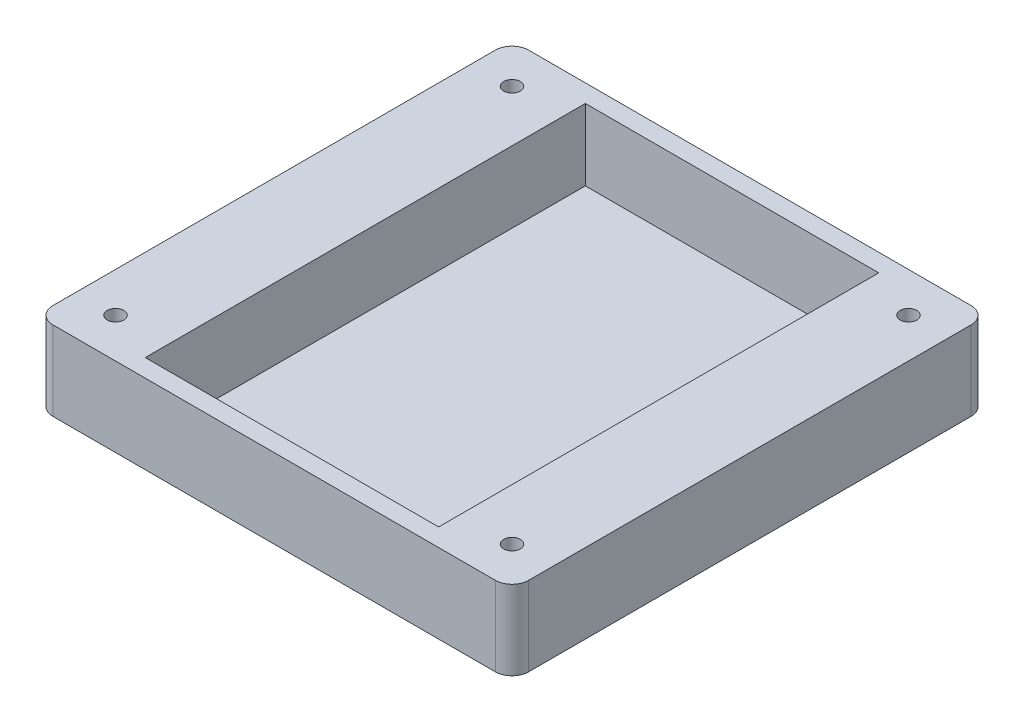
ISO-10303-21;
HEADER;
FILE_DESCRIPTION(('STEP AP214'),'2;1');
FILE_NAME('part.step','',(''),(''),'','','');
FILE_SCHEMA(('AUTOMOTIVE_DESIGN { 1 0 10303 214 1 1 1 1 }'));
ENDSEC;
DATA;
#1=APPLICATION_CONTEXT('core data for automotive mechanical design processes');
#2=APPLICATION_PROTOCOL_DEFINITION('international standard','automotive_design',2000,#1);
#3=PRODUCT_CONTEXT('',#1,'mechanical');
#4=PRODUCT('Part','Part','',(#3));
#5=PRODUCT_RELATED_PRODUCT_CATEGORY('part','',(#4));
#6=PRODUCT_DEFINITION_FORMATION('','',#4);
#7=PRODUCT_DEFINITION_CONTEXT('part definition',#1,'design');
#8=PRODUCT_DEFINITION('design','',#6,#7);
#9=PRODUCT_DEFINITION_SHAPE('','',#8);
#10=(LENGTH_UNIT() NAMED_UNIT(*) SI_UNIT(.MILLI.,.METRE.));
#11=(NAMED_UNIT(*) PLANE_ANGLE_UNIT() SI_UNIT($,.RADIAN.));
#12=(NAMED_UNIT(*) SI_UNIT($,.STERADIAN.) SOLID_ANGLE_UNIT());
#13=UNCERTAINTY_MEASURE_WITH_UNIT(LENGTH_MEASURE(1.E-05),#10,'distance_accuracy_value','');
#14=(GEOMETRIC_REPRESENTATION_CONTEXT(3) GLOBAL_UNCERTAINTY_ASSIGNED_CONTEXT((#13)) GLOBAL_UNIT_ASSIGNED_CONTEXT((#10,
#11,#12)) REPRESENTATION_CONTEXT('',''));
#15=CARTESIAN_POINT('',(0.,0.,0.));
#16=DIRECTION('',(0.,0.,1.));
#17=DIRECTION('',(1.,0.,0.));
#18=AXIS2_PLACEMENT_3D('',#15,#16,#17);
#19=CARTESIAN_POINT('',(55.8,20.,55.8));
#20=DIRECTION('',(0.,-1.,0.));
#21=DIRECTION('',(0.,0.,-1.));
#22=AXIS2_PLACEMENT_3D('',#19,#20,#21);
#23=PLANE('',#22);
#24=DIRECTION('',(-1.,0.,0.));
#25=VECTOR('',#24,1.);
#26=CARTESIAN_POINT('',(-37.,20.,-55.5));
#27=LINE('',#26,#25);
#28=CARTESIAN_POINT('',(37.,20.,-55.5));
#29=VERTEX_POINT('',#28);
#30=CARTESIAN_POINT('',(-37.,20.,-55.5));
#31=VERTEX_POINT('',#30);
#32=EDGE_CURVE('E236',#29,#31,#27,.T.);
#33=ORIENTED_EDGE('',*,*,#32,.F.);
#34=DIRECTION('',(0.,0.,-1.));
#35=VECTOR('',#34,1.);
#36=CARTESIAN_POINT('',(37.,20.,-55.5));
#37=LINE('',#36,#35);
#38=CARTESIAN_POINT('',(37.,20.,55.5));
#39=VERTEX_POINT('',#38);
#40=EDGE_CURVE('E51',#39,#29,#37,.T.);
#41=ORIENTED_EDGE('',*,*,#40,.F.);
#42=DIRECTION('',(1.,0.,0.));
#43=VECTOR('',#42,1.);
#44=CARTESIAN_POINT('',(-37.,20.,55.5));
#45=LINE('',#44,#43);
#46=CARTESIAN_POINT('',(-37.,20.,55.5));
#47=VERTEX_POINT('',#46);
#48=EDGE_CURVE('E229',#47,#39,#45,.T.);
#49=ORIENTED_EDGE('',*,*,#48,.F.);
#50=DIRECTION('',(0.,0.,1.));
#51=VECTOR('',#50,1.);
#52=CARTESIAN_POINT('',(-37.,20.,-55.5));
#53=LINE('',#52,#51);
#54=EDGE_CURVE('E233',#31,#47,#53,.T.);
#55=ORIENTED_EDGE('',*,*,#54,.F.);
#56=EDGE_LOOP('',(#33,#41,#49,#55));
#57=FACE_BOUND('',#56,.T.);
#58=CARTESIAN_POINT('',(55.8,20.,55.8));
#59=DIRECTION('',(0.,1.,0.));
#60=DIRECTION('',(0.,0.,-1.));
#61=AXIS2_PLACEMENT_3D('',#58,#59,#60);
#62=CIRCLE('',#61,4.2);
#63=CARTESIAN_POINT('',(55.8,20.,60.));
#64=VERTEX_POINT('',#63);
#65=CARTESIAN_POINT('',(60.,20.,55.8));
#66=VERTEX_POINT('',#65);
#67=EDGE_CURVE('E161',#64,#66,#62,.T.);
#68=ORIENTED_EDGE('',*,*,#67,.T.);
#69=DIRECTION('',(0.,0.,-1.));
#70=VECTOR('',#69,1.);
#71=CARTESIAN_POINT('',(60.,20.,-55.8));
#72=LINE('',#71,#70);
#73=CARTESIAN_POINT('',(60.,20.,-55.8));
#74=VERTEX_POINT('',#73);
#75=EDGE_CURVE('E101',#66,#74,#72,.T.);
#76=ORIENTED_EDGE('',*,*,#75,.T.);
#77=CARTESIAN_POINT('',(55.8,20.,-55.8));
#78=DIRECTION('',(0.,1.,0.));
#79=DIRECTION('',(0.,0.,1.));
#80=AXIS2_PLACEMENT_3D('',#77,#78,#79);
#81=CIRCLE('',#80,4.2);
#82=CARTESIAN_POINT('',(55.8,20.,-60.));
#83=VERTEX_POINT('',#82);
#84=EDGE_CURVE('E176',#74,#83,#81,.T.);
#85=ORIENTED_EDGE('',*,*,#84,.T.);
#86=DIRECTION('',(-1.,0.,0.));
#87=VECTOR('',#86,1.);
#88=CARTESIAN_POINT('',(-55.8,20.,-60.));
#89=LINE('',#88,#87);
#90=CARTESIAN_POINT('',(-55.8,20.,-60.));
#91=VERTEX_POINT('',#90);
#92=EDGE_CURVE('E189',#83,#91,#89,.T.);
#93=ORIENTED_EDGE('',*,*,#92,.T.);
#94=CARTESIAN_POINT('',(-55.8,20.,-55.8));
#95=DIRECTION('',(0.,1.,0.));
#96=DIRECTION('',(0.,0.,-1.));
#97=AXIS2_PLACEMENT_3D('',#94,#95,#96);
#98=CIRCLE('',#97,4.2);
#99=CARTESIAN_POINT('',(-60.,20.,-55.8));
#100=VERTEX_POINT('',#99);
#101=EDGE_CURVE('E124',#91,#100,#98,.T.);
#102=ORIENTED_EDGE('',*,*,#101,.T.);
#103=DIRECTION('',(0.,0.,1.));
#104=VECTOR('',#103,1.);
#105=CARTESIAN_POINT('',(-60.,20.,-55.8));
#106=LINE('',#105,#104);
#107=CARTESIAN_POINT('',(-60.,20.,55.8));
#108=VERTEX_POINT('',#107);
#109=EDGE_CURVE('E117',#100,#108,#106,.T.);
#110=ORIENTED_EDGE('',*,*,#109,.T.);
#111=CARTESIAN_POINT('',(-55.8,20.,55.8));
#112=DIRECTION('',(0.,1.,0.));
#113=DIRECTION('',(0.,0.,1.));
#114=AXIS2_PLACEMENT_3D('',#111,#112,#113);
#115=CIRCLE('',#114,4.20000000000001);
#116=CARTESIAN_POINT('',(-55.8,20.,60.));
#117=VERTEX_POINT('',#116);
#118=EDGE_CURVE('E121',#108,#117,#115,.T.);
#119=ORIENTED_EDGE('',*,*,#118,.T.);
#120=DIRECTION('',(1.,0.,0.));
#121=VECTOR('',#120,1.);
#122=CARTESIAN_POINT('',(-55.8,20.,60.));
#123=LINE('',#122,#121);
#124=EDGE_CURVE('E60',#117,#64,#123,.T.);
#125=ORIENTED_EDGE('',*,*,#124,.T.);
#126=EDGE_LOOP('',(#68,#76,#85,#93,#102,#110,#119,#125));
#127=FACE_BOUND('',#126,.T.);
#128=CARTESIAN_POINT('',(49.9999999999999,20.,-50.));
#129=DIRECTION('',(0.,1.,0.));
#130=DIRECTION('',(0.,0.,1.));
#131=AXIS2_PLACEMENT_3D('',#128,#129,#130);
#132=CIRCLE('',#131,2.1);
#133=CARTESIAN_POINT('',(49.9999999999999,20.,-47.9));
#134=VERTEX_POINT('',#133);
#135=EDGE_CURVE('E149',#134,#134,#132,.T.);
#136=ORIENTED_EDGE('',*,*,#135,.F.);
#137=EDGE_LOOP('',(#136));
#138=FACE_BOUND('',#137,.T.);
#139=CARTESIAN_POINT('',(-50.0000000000001,20.,-50.));
#140=DIRECTION('',(0.,1.,0.));
#141=DIRECTION('',(0.,0.,-1.));
#142=AXIS2_PLACEMENT_3D('',#139,#140,#141);
#143=CIRCLE('',#142,2.1);
#144=CARTESIAN_POINT('',(-50.0000000000001,20.,-52.1));
#145=VERTEX_POINT('',#144);
#146=EDGE_CURVE('E198',#145,#145,#143,.T.);
#147=ORIENTED_EDGE('',*,*,#146,.F.);
#148=EDGE_LOOP('',(#147));
#149=FACE_BOUND('',#148,.T.);
#150=CARTESIAN_POINT('',(49.9999999999999,20.,50.));
#151=DIRECTION('',(0.,1.,0.));
#152=DIRECTION('',(0.,0.,-1.));
#153=AXIS2_PLACEMENT_3D('',#150,#151,#152);
#154=CIRCLE('',#153,2.1);
#155=CARTESIAN_POINT('',(49.9999999999999,20.,47.9));
#156=VERTEX_POINT('',#155);
#157=EDGE_CURVE('E204',#156,#156,#154,.T.);
#158=ORIENTED_EDGE('',*,*,#157,.F.);
#159=EDGE_LOOP('',(#158));
#160=FACE_BOUND('',#159,.T.);
#161=CARTESIAN_POINT('',(-50.0000000000001,20.,50.));
#162=DIRECTION('',(0.,1.,0.));
#163=DIRECTION('',(0.,0.,1.));
#164=AXIS2_PLACEMENT_3D('',#161,#162,#163);
#165=CIRCLE('',#164,2.10000000000004);
#166=CARTESIAN_POINT('',(-50.0000000000001,20.,52.1000000000001));
#167=VERTEX_POINT('',#166);
#168=EDGE_CURVE('E210',#167,#167,#165,.T.);
#169=ORIENTED_EDGE('',*,*,#168,.F.);
#170=EDGE_LOOP('',(#169));
#171=FACE_BOUND('',#170,.T.);
#172=ADVANCED_FACE('F36',(#57,#127,#138,#149,#160,#171),#23,.F.);
#173=CARTESIAN_POINT('',(55.8,0.,55.8));
#174=DIRECTION('',(0.,-1.,0.));
#175=DIRECTION('',(0.,0.,-1.));
#176=AXIS2_PLACEMENT_3D('',#173,#174,#175);
#177=PLANE('',#176);
#178=CARTESIAN_POINT('',(49.9999999999999,0.,50.));
#179=DIRECTION('',(0.,1.,0.));
#180=DIRECTION('',(0.,0.,-1.));
#181=AXIS2_PLACEMENT_3D('',#178,#179,#180);
#182=CIRCLE('',#181,2.1);
#183=CARTESIAN_POINT('',(49.9999999999999,0.,47.9));
#184=VERTEX_POINT('',#183);
#185=EDGE_CURVE('E207',#184,#184,#182,.T.);
#186=ORIENTED_EDGE('',*,*,#185,.T.);
#187=EDGE_LOOP('',(#186));
#188=FACE_BOUND('',#187,.T.);
#189=CARTESIAN_POINT('',(49.9999999999999,0.,-50.));
#190=DIRECTION('',(0.,1.,0.));
#191=DIRECTION('',(0.,0.,1.));
#192=AXIS2_PLACEMENT_3D('',#189,#190,#191);
#193=CIRCLE('',#192,2.1);
#194=CARTESIAN_POINT('',(49.9999999999999,0.,-47.9));
#195=VERTEX_POINT('',#194);
#196=EDGE_CURVE('E195',#195,#195,#193,.T.);
#197=ORIENTED_EDGE('',*,*,#196,.T.);
#198=EDGE_LOOP('',(#197));
#199=FACE_BOUND('',#198,.T.);
#200=CARTESIAN_POINT('',(55.8,0.,55.8));
#201=DIRECTION('',(0.,1.,0.));
#202=DIRECTION('',(0.,0.,-1.));
#203=AXIS2_PLACEMENT_3D('',#200,#201,#202);
#204=CIRCLE('',#203,4.2);
#205=CARTESIAN_POINT('',(55.8,0.,60.));
#206=VERTEX_POINT('',#205);
#207=CARTESIAN_POINT('',(60.,0.,55.8));
#208=VERTEX_POINT('',#207);
#209=EDGE_CURVE('E145',#206,#208,#204,.T.);
#210=ORIENTED_EDGE('',*,*,#209,.F.);
#211=DIRECTION('',(1.,0.,0.));
#212=VECTOR('',#211,1.);
#213=CARTESIAN_POINT('',(-55.8,0.,60.));
#214=LINE('',#213,#212);
#215=CARTESIAN_POINT('',(-55.8,0.,60.));
#216=VERTEX_POINT('',#215);
#217=EDGE_CURVE('E93',#216,#206,#214,.T.);
#218=ORIENTED_EDGE('',*,*,#217,.F.);
#219=CARTESIAN_POINT('',(-55.8,0.,55.8));
#220=DIRECTION('',(0.,1.,0.));
#221=DIRECTION('',(0.,0.,1.));
#222=AXIS2_PLACEMENT_3D('',#219,#220,#221);
#223=CIRCLE('',#222,4.20000000000001);
#224=CARTESIAN_POINT('',(-60.,0.,55.8));
#225=VERTEX_POINT('',#224);
#226=EDGE_CURVE('E158',#225,#216,#223,.T.);
#227=ORIENTED_EDGE('',*,*,#226,.F.);
#228=DIRECTION('',(0.,0.,1.));
#229=VECTOR('',#228,1.);
#230=CARTESIAN_POINT('',(-60.,0.,-55.8));
#231=LINE('',#230,#229);
#232=CARTESIAN_POINT('',(-60.,0.,-55.8));
#233=VERTEX_POINT('',#232);
#234=EDGE_CURVE('E133',#233,#225,#231,.T.);
#235=ORIENTED_EDGE('',*,*,#234,.F.);
#236=CARTESIAN_POINT('',(-55.8,0.,-55.8));
#237=DIRECTION('',(0.,1.,0.));
#238=DIRECTION('',(0.,0.,-1.));
#239=AXIS2_PLACEMENT_3D('',#236,#237,#238);
#240=CIRCLE('',#239,4.2);
#241=CARTESIAN_POINT('',(-55.8,0.,-60.));
#242=VERTEX_POINT('',#241);
#243=EDGE_CURVE('E155',#242,#233,#240,.T.);
#244=ORIENTED_EDGE('',*,*,#243,.F.);
#245=DIRECTION('',(-1.,0.,0.));
#246=VECTOR('',#245,1.);
#247=CARTESIAN_POINT('',(-55.8,0.,-60.));
#248=LINE('',#247,#246);
#249=CARTESIAN_POINT('',(55.8,0.,-60.));
#250=VERTEX_POINT('',#249);
#251=EDGE_CURVE('E153',#250,#242,#248,.T.);
#252=ORIENTED_EDGE('',*,*,#251,.F.);
#253=CARTESIAN_POINT('',(55.8,0.,-55.8));
#254=DIRECTION('',(0.,1.,0.));
#255=DIRECTION('',(0.,0.,1.));
#256=AXIS2_PLACEMENT_3D('',#253,#254,#255);
#257=CIRCLE('',#256,4.2);
#258=CARTESIAN_POINT('',(60.,0.,-55.8));
#259=VERTEX_POINT('',#258);
#260=EDGE_CURVE('E151',#259,#250,#257,.T.);
#261=ORIENTED_EDGE('',*,*,#260,.F.);
#262=DIRECTION('',(0.,0.,-1.));
#263=VECTOR('',#262,1.);
#264=CARTESIAN_POINT('',(60.,0.,-55.8));
#265=LINE('',#264,#263);
#266=EDGE_CURVE('E148',#208,#259,#265,.T.);
#267=ORIENTED_EDGE('',*,*,#266,.F.);
#268=EDGE_LOOP('',(#210,#218,#227,#235,#244,#252,#261,#267));
#269=FACE_BOUND('',#268,.T.);
#270=CARTESIAN_POINT('',(-50.0000000000001,0.,-50.));
#271=DIRECTION('',(0.,1.,0.));
#272=DIRECTION('',(0.,0.,-1.));
#273=AXIS2_PLACEMENT_3D('',#270,#271,#272);
#274=CIRCLE('',#273,2.1);
#275=CARTESIAN_POINT('',(-50.0000000000001,0.,-52.1));
#276=VERTEX_POINT('',#275);
#277=EDGE_CURVE('E201',#276,#276,#274,.T.);
#278=ORIENTED_EDGE('',*,*,#277,.T.);
#279=EDGE_LOOP('',(#278));
#280=FACE_BOUND('',#279,.T.);
#281=CARTESIAN_POINT('',(-50.0000000000001,0.,50.));
#282=DIRECTION('',(0.,1.,0.));
#283=DIRECTION('',(0.,0.,1.));
#284=AXIS2_PLACEMENT_3D('',#281,#282,#283);
#285=CIRCLE('',#284,2.10000000000004);
#286=CARTESIAN_POINT('',(-50.0000000000001,0.,52.1000000000001));
#287=VERTEX_POINT('',#286);
#288=EDGE_CURVE('E213',#287,#287,#285,.T.);
#289=ORIENTED_EDGE('',*,*,#288,.T.);
#290=EDGE_LOOP('',(#289));
#291=FACE_BOUND('',#290,.T.);
#292=ADVANCED_FACE('F180',(#188,#199,#269,#280,#291),#177,.T.);
#293=CARTESIAN_POINT('',(55.8,20.,55.8));
#294=DIRECTION('',(0.,-1.,0.));
#295=DIRECTION('',(0.,0.,-1.));
#296=AXIS2_PLACEMENT_3D('',#293,#294,#295);
#297=CYLINDRICAL_SURFACE('',#296,4.2);
#298=ORIENTED_EDGE('',*,*,#209,.T.);
#299=DIRECTION('',(0.,-1.,0.));
#300=VECTOR('',#299,1.);
#301=CARTESIAN_POINT('',(60.,20.,55.8));
#302=LINE('',#301,#300);
#303=EDGE_CURVE('E11',#66,#208,#302,.T.);
#304=ORIENTED_EDGE('',*,*,#303,.F.);
#305=ORIENTED_EDGE('',*,*,#67,.F.);
#306=DIRECTION('',(0.,-1.,0.));
#307=VECTOR('',#306,1.);
#308=CARTESIAN_POINT('',(55.8,20.,60.));
#309=LINE('',#308,#307);
#310=EDGE_CURVE('E141',#64,#206,#309,.T.);
#311=ORIENTED_EDGE('',*,*,#310,.T.);
#312=EDGE_LOOP('',(#298,#304,#305,#311));
#313=FACE_BOUND('',#312,.T.);
#314=ADVANCED_FACE('F38',(#313),#297,.T.);
#315=CARTESIAN_POINT('',(60.,20.,-55.8));
#316=DIRECTION('',(-1.,0.,0.));
#317=DIRECTION('',(0.,0.,1.));
#318=AXIS2_PLACEMENT_3D('',#315,#316,#317);
#319=PLANE('',#318);
#320=ORIENTED_EDGE('',*,*,#266,.T.);
#321=DIRECTION('',(0.,-1.,0.));
#322=VECTOR('',#321,1.);
#323=CARTESIAN_POINT('',(60.,20.,-55.8));
#324=LINE('',#323,#322);
#325=EDGE_CURVE('E44',#74,#259,#324,.T.);
#326=ORIENTED_EDGE('',*,*,#325,.F.);
#327=ORIENTED_EDGE('',*,*,#75,.F.);
#328=ORIENTED_EDGE('',*,*,#303,.T.);
#329=EDGE_LOOP('',(#320,#326,#327,#328));
#330=FACE_BOUND('',#329,.T.);
#331=ADVANCED_FACE('F311',(#330),#319,.F.);
#332=CARTESIAN_POINT('',(55.8,20.,-55.8));
#333=DIRECTION('',(0.,-1.,0.));
#334=DIRECTION('',(0.,0.,-1.));
#335=AXIS2_PLACEMENT_3D('',#332,#333,#334);
#336=CYLINDRICAL_SURFACE('',#335,4.2);
#337=ORIENTED_EDGE('',*,*,#260,.T.);
#338=DIRECTION('',(0.,-1.,0.));
#339=VECTOR('',#338,1.);
#340=CARTESIAN_POINT('',(55.8,20.,-60.));
#341=LINE('',#340,#339);
#342=EDGE_CURVE('E168',#83,#250,#341,.T.);
#343=ORIENTED_EDGE('',*,*,#342,.F.);
#344=ORIENTED_EDGE('',*,*,#84,.F.);
#345=ORIENTED_EDGE('',*,*,#325,.T.);
#346=EDGE_LOOP('',(#337,#343,#344,#345));
#347=FACE_BOUND('',#346,.T.);
#348=ADVANCED_FACE('F174',(#347),#336,.T.);
#349=CARTESIAN_POINT('',(-55.8,20.,-60.));
#350=DIRECTION('',(0.,0.,1.));
#351=DIRECTION('',(1.,0.,0.));
#352=AXIS2_PLACEMENT_3D('',#349,#350,#351);
#353=PLANE('',#352);
#354=ORIENTED_EDGE('',*,*,#251,.T.);
#355=DIRECTION('',(0.,-1.,0.));
#356=VECTOR('',#355,1.);
#357=CARTESIAN_POINT('',(-55.8,20.,-60.));
#358=LINE('',#357,#356);
#359=EDGE_CURVE('E165',#91,#242,#358,.T.);
#360=ORIENTED_EDGE('',*,*,#359,.F.);
#361=ORIENTED_EDGE('',*,*,#92,.F.);
#362=ORIENTED_EDGE('',*,*,#342,.T.);
#363=EDGE_LOOP('',(#354,#360,#361,#362));
#364=FACE_BOUND('',#363,.T.);
#365=ADVANCED_FACE('F185',(#364),#353,.F.);
#366=CARTESIAN_POINT('',(-55.8,20.,-55.8));
#367=DIRECTION('',(0.,-1.,0.));
#368=DIRECTION('',(0.,0.,-1.));
#369=AXIS2_PLACEMENT_3D('',#366,#367,#368);
#370=CYLINDRICAL_SURFACE('',#369,4.2);
#371=ORIENTED_EDGE('',*,*,#243,.T.);
#372=DIRECTION('',(0.,-1.,0.));
#373=VECTOR('',#372,1.);
#374=CARTESIAN_POINT('',(-60.,20.,-55.8));
#375=LINE('',#374,#373);
#376=EDGE_CURVE('E136',#100,#233,#375,.T.);
#377=ORIENTED_EDGE('',*,*,#376,.F.);
#378=ORIENTED_EDGE('',*,*,#101,.F.);
#379=ORIENTED_EDGE('',*,*,#359,.T.);
#380=EDGE_LOOP('',(#371,#377,#378,#379));
#381=FACE_BOUND('',#380,.T.);
#382=ADVANCED_FACE('F188',(#381),#370,.T.);
#383=CARTESIAN_POINT('',(-60.,20.,-55.8));
#384=DIRECTION('',(1.,0.,0.));
#385=DIRECTION('',(0.,0.,-1.));
#386=AXIS2_PLACEMENT_3D('',#383,#384,#385);
#387=PLANE('',#386);
#388=ORIENTED_EDGE('',*,*,#234,.T.);
#389=DIRECTION('',(0.,-1.,0.));
#390=VECTOR('',#389,1.);
#391=CARTESIAN_POINT('',(-60.,20.,55.8));
#392=LINE('',#391,#390);
#393=EDGE_CURVE('E130',#108,#225,#392,.T.);
#394=ORIENTED_EDGE('',*,*,#393,.F.);
#395=ORIENTED_EDGE('',*,*,#109,.F.);
#396=ORIENTED_EDGE('',*,*,#376,.T.);
#397=EDGE_LOOP('',(#388,#394,#395,#396));
#398=FACE_BOUND('',#397,.T.);
#399=ADVANCED_FACE('F131',(#398),#387,.F.);
#400=CARTESIAN_POINT('',(-55.8,20.,55.8));
#401=DIRECTION('',(0.,-1.,0.));
#402=DIRECTION('',(0.,0.,-1.));
#403=AXIS2_PLACEMENT_3D('',#400,#401,#402);
#404=CYLINDRICAL_SURFACE('',#403,4.20000000000001);
#405=ORIENTED_EDGE('',*,*,#226,.T.);
#406=DIRECTION('',(0.,-1.,0.));
#407=VECTOR('',#406,1.);
#408=CARTESIAN_POINT('',(-55.8,20.,60.));
#409=LINE('',#408,#407);
#410=EDGE_CURVE('E137',#117,#216,#409,.T.);
#411=ORIENTED_EDGE('',*,*,#410,.F.);
#412=ORIENTED_EDGE('',*,*,#118,.F.);
#413=ORIENTED_EDGE('',*,*,#393,.T.);
#414=EDGE_LOOP('',(#405,#411,#412,#413));
#415=FACE_BOUND('',#414,.T.);
#416=ADVANCED_FACE('F139',(#415),#404,.T.);
#417=CARTESIAN_POINT('',(-55.8,20.,60.));
#418=DIRECTION('',(0.,0.,-1.));
#419=DIRECTION('',(-1.,0.,0.));
#420=AXIS2_PLACEMENT_3D('',#417,#418,#419);
#421=PLANE('',#420);
#422=ORIENTED_EDGE('',*,*,#217,.T.);
#423=ORIENTED_EDGE('',*,*,#310,.F.);
#424=ORIENTED_EDGE('',*,*,#124,.F.);
#425=ORIENTED_EDGE('',*,*,#410,.T.);
#426=EDGE_LOOP('',(#422,#423,#424,#425));
#427=FACE_BOUND('',#426,.T.);
#428=ADVANCED_FACE('F299',(#427),#421,.F.);
#429=CARTESIAN_POINT('',(49.9999999999999,20.,-50.));
#430=DIRECTION('',(0.,-1.,0.));
#431=DIRECTION('',(0.,0.,-1.));
#432=AXIS2_PLACEMENT_3D('',#429,#430,#431);
#433=CYLINDRICAL_SURFACE('',#432,2.1);
#434=ORIENTED_EDGE('',*,*,#135,.T.);
#435=EDGE_LOOP('',(#434));
#436=FACE_BOUND('',#435,.T.);
#437=ORIENTED_EDGE('',*,*,#196,.F.);
#438=EDGE_LOOP('',(#437));
#439=FACE_BOUND('',#438,.T.);
#440=ADVANCED_FACE('F296',(#436,#439),#433,.F.);
#441=CARTESIAN_POINT('',(-50.0000000000001,20.,-50.));
#442=DIRECTION('',(0.,-1.,0.));
#443=DIRECTION('',(0.,0.,-1.));
#444=AXIS2_PLACEMENT_3D('',#441,#442,#443);
#445=CYLINDRICAL_SURFACE('',#444,2.1);
#446=ORIENTED_EDGE('',*,*,#146,.T.);
#447=EDGE_LOOP('',(#446));
#448=FACE_BOUND('',#447,.T.);
#449=ORIENTED_EDGE('',*,*,#277,.F.);
#450=EDGE_LOOP('',(#449));
#451=FACE_BOUND('',#450,.T.);
#452=ADVANCED_FACE('F394',(#448,#451),#445,.F.);
#453=CARTESIAN_POINT('',(49.9999999999999,20.,50.));
#454=DIRECTION('',(0.,-1.,0.));
#455=DIRECTION('',(0.,0.,-1.));
#456=AXIS2_PLACEMENT_3D('',#453,#454,#455);
#457=CYLINDRICAL_SURFACE('',#456,2.1);
#458=ORIENTED_EDGE('',*,*,#157,.T.);
#459=EDGE_LOOP('',(#458));
#460=FACE_BOUND('',#459,.T.);
#461=ORIENTED_EDGE('',*,*,#185,.F.);
#462=EDGE_LOOP('',(#461));
#463=FACE_BOUND('',#462,.T.);
#464=ADVANCED_FACE('F404',(#460,#463),#457,.F.);
#465=CARTESIAN_POINT('',(-50.0000000000001,20.,50.));
#466=DIRECTION('',(0.,-1.,0.));
#467=DIRECTION('',(0.,0.,-1.));
#468=AXIS2_PLACEMENT_3D('',#465,#466,#467);
#469=CYLINDRICAL_SURFACE('',#468,2.10000000000004);
#470=ORIENTED_EDGE('',*,*,#168,.T.);
#471=EDGE_LOOP('',(#470));
#472=FACE_BOUND('',#471,.T.);
#473=ORIENTED_EDGE('',*,*,#288,.F.);
#474=EDGE_LOOP('',(#473));
#475=FACE_BOUND('',#474,.T.);
#476=ADVANCED_FACE('F414',(#472,#475),#469,.F.);
#477=CARTESIAN_POINT('',(37.,2.,-55.5));
#478=DIRECTION('',(1.,0.,0.));
#479=DIRECTION('',(0.,0.,-1.));
#480=AXIS2_PLACEMENT_3D('',#477,#478,#479);
#481=PLANE('',#480);
#482=ORIENTED_EDGE('',*,*,#40,.T.);
#483=DIRECTION('',(0.,1.,0.));
#484=VECTOR('',#483,1.);
#485=CARTESIAN_POINT('',(37.,2.,-55.5));
#486=LINE('',#485,#484);
#487=CARTESIAN_POINT('',(37.,2.,-55.5));
#488=VERTEX_POINT('',#487);
#489=EDGE_CURVE('E219',#488,#29,#486,.T.);
#490=ORIENTED_EDGE('',*,*,#489,.F.);
#491=DIRECTION('',(0.,0.,-1.));
#492=VECTOR('',#491,1.);
#493=CARTESIAN_POINT('',(37.,2.,-55.5));
#494=LINE('',#493,#492);
#495=CARTESIAN_POINT('',(37.,2.,55.5));
#496=VERTEX_POINT('',#495);
#497=EDGE_CURVE('E232',#496,#488,#494,.T.);
#498=ORIENTED_EDGE('',*,*,#497,.F.);
#499=DIRECTION('',(0.,1.,0.));
#500=VECTOR('',#499,1.);
#501=CARTESIAN_POINT('',(37.,2.,55.5));
#502=LINE('',#501,#500);
#503=EDGE_CURVE('E216',#496,#39,#502,.T.);
#504=ORIENTED_EDGE('',*,*,#503,.T.);
#505=EDGE_LOOP('',(#482,#490,#498,#504));
#506=FACE_BOUND('',#505,.T.);
#507=ADVANCED_FACE('F257',(#506),#481,.F.);
#508=CARTESIAN_POINT('',(-37.,2.,55.5));
#509=DIRECTION('',(0.,0.,1.));
#510=DIRECTION('',(1.,0.,0.));
#511=AXIS2_PLACEMENT_3D('',#508,#509,#510);
#512=PLANE('',#511);
#513=ORIENTED_EDGE('',*,*,#48,.T.);
#514=ORIENTED_EDGE('',*,*,#503,.F.);
#515=DIRECTION('',(1.,0.,0.));
#516=VECTOR('',#515,1.);
#517=CARTESIAN_POINT('',(-37.,2.,55.5));
#518=LINE('',#517,#516);
#519=CARTESIAN_POINT('',(-37.,2.,55.5));
#520=VERTEX_POINT('',#519);
#521=EDGE_CURVE('E222',#520,#496,#518,.T.);
#522=ORIENTED_EDGE('',*,*,#521,.F.);
#523=DIRECTION('',(0.,1.,0.));
#524=VECTOR('',#523,1.);
#525=CARTESIAN_POINT('',(-37.,2.,55.5));
#526=LINE('',#525,#524);
#527=EDGE_CURVE('E225',#520,#47,#526,.T.);
#528=ORIENTED_EDGE('',*,*,#527,.T.);
#529=EDGE_LOOP('',(#513,#514,#522,#528));
#530=FACE_BOUND('',#529,.T.);
#531=ADVANCED_FACE('F268',(#530),#512,.F.);
#532=CARTESIAN_POINT('',(-37.,2.,-55.5));
#533=DIRECTION('',(-1.,0.,0.));
#534=DIRECTION('',(0.,0.,1.));
#535=AXIS2_PLACEMENT_3D('',#532,#533,#534);
#536=PLANE('',#535);
#537=ORIENTED_EDGE('',*,*,#54,.T.);
#538=ORIENTED_EDGE('',*,*,#527,.F.);
#539=DIRECTION('',(0.,0.,1.));
#540=VECTOR('',#539,1.);
#541=CARTESIAN_POINT('',(-37.,2.,-55.5));
#542=LINE('',#541,#540);
#543=CARTESIAN_POINT('',(-37.,2.,-55.5));
#544=VERTEX_POINT('',#543);
#545=EDGE_CURVE('E242',#544,#520,#542,.T.);
#546=ORIENTED_EDGE('',*,*,#545,.F.);
#547=DIRECTION('',(0.,1.,0.));
#548=VECTOR('',#547,1.);
#549=CARTESIAN_POINT('',(-37.,2.,-55.5));
#550=LINE('',#549,#548);
#551=EDGE_CURVE('E221',#544,#31,#550,.T.);
#552=ORIENTED_EDGE('',*,*,#551,.T.);
#553=EDGE_LOOP('',(#537,#538,#546,#552));
#554=FACE_BOUND('',#553,.T.);
#555=ADVANCED_FACE('F273',(#554),#536,.F.);
#556=CARTESIAN_POINT('',(-37.,2.,-55.5));
#557=DIRECTION('',(0.,0.,-1.));
#558=DIRECTION('',(-1.,0.,0.));
#559=AXIS2_PLACEMENT_3D('',#556,#557,#558);
#560=PLANE('',#559);
#561=ORIENTED_EDGE('',*,*,#32,.T.);
#562=ORIENTED_EDGE('',*,*,#551,.F.);
#563=DIRECTION('',(-1.,0.,0.));
#564=VECTOR('',#563,1.);
#565=CARTESIAN_POINT('',(-37.,2.,-55.5));
#566=LINE('',#565,#564);
#567=EDGE_CURVE('E245',#488,#544,#566,.T.);
#568=ORIENTED_EDGE('',*,*,#567,.F.);
#569=ORIENTED_EDGE('',*,*,#489,.T.);
#570=EDGE_LOOP('',(#561,#562,#568,#569));
#571=FACE_BOUND('',#570,.T.);
#572=ADVANCED_FACE('F278',(#571),#560,.F.);
#573=CARTESIAN_POINT('',(0.,2.,0.));
#574=DIRECTION('',(0.,1.,0.));
#575=DIRECTION('',(0.,0.,1.));
#576=AXIS2_PLACEMENT_3D('',#573,#574,#575);
#577=PLANE('',#576);
#578=ORIENTED_EDGE('',*,*,#497,.T.);
#579=ORIENTED_EDGE('',*,*,#567,.T.);
#580=ORIENTED_EDGE('',*,*,#545,.T.);
#581=ORIENTED_EDGE('',*,*,#521,.T.);
#582=EDGE_LOOP('',(#578,#579,#580,#581));
#583=FACE_BOUND('',#582,.T.);
#584=ADVANCED_FACE('F252',(#583),#577,.T.);
#585=CLOSED_SHELL('',(#172,#292,#314,#331,#348,#365,#382,#399,#416,#428,#440,#452,#464,#476,
#507,#531,#555,#572,#584));
#586=MANIFOLD_SOLID_BREP('B2',#585);
#587=ADVANCED_BREP_SHAPE_REPRESENTATION('',(#18,#586),#14);
#588=SHAPE_DEFINITION_REPRESENTATION(#9,#587);
ENDSEC;
END-ISO-10303-21;
